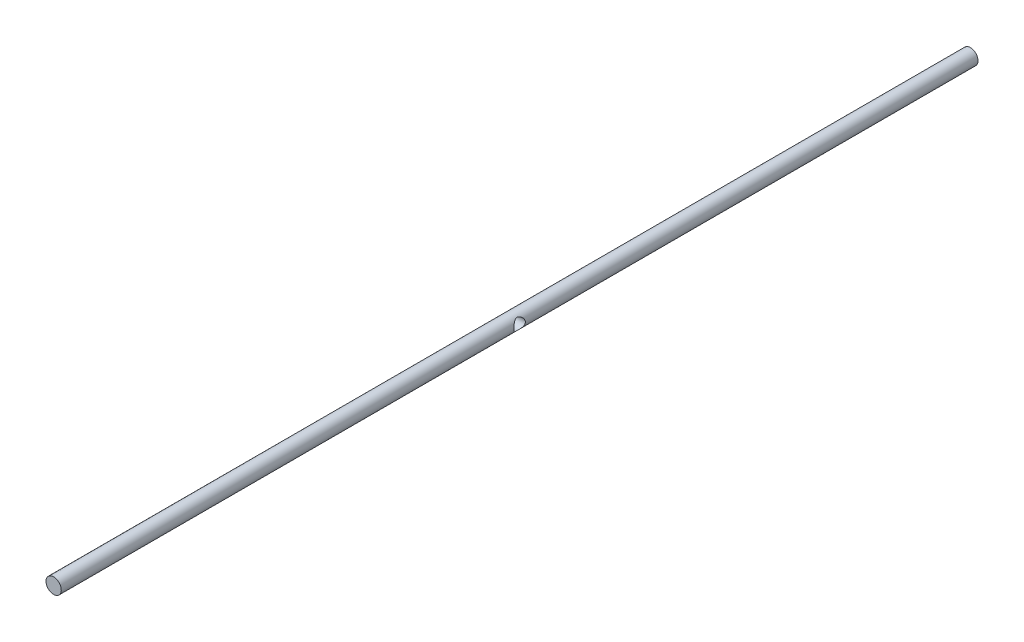
ISO-10303-21;
HEADER;
FILE_DESCRIPTION(('STEP AP214'),'2;1');
FILE_NAME('part.step','',(''),(''),'','','');
FILE_SCHEMA(('AUTOMOTIVE_DESIGN { 1 0 10303 214 1 1 1 1 }'));
ENDSEC;
DATA;
#1=APPLICATION_CONTEXT('core data for automotive mechanical design processes');
#2=APPLICATION_PROTOCOL_DEFINITION('international standard','automotive_design',2000,#1);
#3=PRODUCT_CONTEXT('',#1,'mechanical');
#4=PRODUCT('Part','Part','',(#3));
#5=PRODUCT_RELATED_PRODUCT_CATEGORY('part','',(#4));
#6=PRODUCT_DEFINITION_FORMATION('','',#4);
#7=PRODUCT_DEFINITION_CONTEXT('part definition',#1,'design');
#8=PRODUCT_DEFINITION('design','',#6,#7);
#9=PRODUCT_DEFINITION_SHAPE('','',#8);
#10=(LENGTH_UNIT() NAMED_UNIT(*) SI_UNIT(.MILLI.,.METRE.));
#11=(NAMED_UNIT(*) PLANE_ANGLE_UNIT() SI_UNIT($,.RADIAN.));
#12=(NAMED_UNIT(*) SI_UNIT($,.STERADIAN.) SOLID_ANGLE_UNIT());
#13=UNCERTAINTY_MEASURE_WITH_UNIT(LENGTH_MEASURE(1.E-05),#10,'distance_accuracy_value','');
#14=(GEOMETRIC_REPRESENTATION_CONTEXT(3) GLOBAL_UNCERTAINTY_ASSIGNED_CONTEXT((#13)) GLOBAL_UNIT_ASSIGNED_CONTEXT((#10,
#11,#12)) REPRESENTATION_CONTEXT('',''));
#15=CARTESIAN_POINT('',(0.,0.,0.));
#16=DIRECTION('',(0.,0.,1.));
#17=DIRECTION('',(1.,0.,0.));
#18=AXIS2_PLACEMENT_3D('',#15,#16,#17);
#19=CARTESIAN_POINT('',(0.,0.,381.));
#20=DIRECTION('',(0.,0.,-1.));
#21=DIRECTION('',(-1.,0.,0.));
#22=AXIS2_PLACEMENT_3D('',#19,#20,#21);
#23=CYLINDRICAL_SURFACE('',#22,6.35);
#24=CARTESIAN_POINT('',(-6.35,0.,-4.76249999999989));
#25=CARTESIAN_POINT('',(-6.34999889011326,0.116299209010284,-4.76249884995358));
#26=CARTESIAN_POINT('',(-6.34679719779935,0.232627541564826,-4.75823219253265));
#27=CARTESIAN_POINT('',(-6.33406240886009,0.464365751437165,-4.74123228514264));
#28=CARTESIAN_POINT('',(-6.32452552374318,0.579775037341468,-4.72849396905454));
#29=CARTESIAN_POINT('',(-6.29932178537642,0.808921904593725,-4.69472978212608));
#30=CARTESIAN_POINT('',(-6.28364325155278,0.92265586949063,-4.67368811889171));
#31=CARTESIAN_POINT('',(-6.24650879607319,1.14743825156485,-4.62364135446186));
#32=CARTESIAN_POINT('',(-6.22505029570613,1.2584854458909,-4.5946326987079));
#33=CARTESIAN_POINT('',(-6.17697760117065,1.47641942011833,-4.52928756430886));
#34=CARTESIAN_POINT('',(-6.15039827015815,1.58332877237456,-4.49300057233978));
#35=CARTESIAN_POINT('',(-6.09251695768087,1.79321187438471,-4.41343520594777));
#36=CARTESIAN_POINT('',(-6.06121310800096,1.89618404698207,-4.3701540653496));
#37=CARTESIAN_POINT('',(-5.96110595313219,2.19832174201322,-4.23059360444687));
#38=CARTESIAN_POINT('',(-5.88604215862559,2.39099228239341,-4.12451051997832));
#39=CARTESIAN_POINT('',(-5.71656897819981,2.77328649714528,-3.87900589903878));
#40=CARTESIAN_POINT('',(-5.62101182240466,2.96097577060041,-3.73740680323089));
#41=CARTESIAN_POINT('',(-5.42183902033636,3.31161900176228,-3.43059012603267));
#42=CARTESIAN_POINT('',(-5.31821104740761,3.4745339549048,-3.26533608036306));
#43=CARTESIAN_POINT('',(-5.15131398293457,3.71464355065618,-2.98364957737033));
#44=CARTESIAN_POINT('',(-5.08839642759211,3.80014924208561,-2.8739616269331));
#45=CARTESIAN_POINT('',(-4.96374570688253,3.96157985034353,-2.64701532460445));
#46=CARTESIAN_POINT('',(-4.90201290339736,4.03750187813244,-2.52975470592371));
#47=CARTESIAN_POINT('',(-4.7817052155672,4.17928602221378,-2.28792332780555));
#48=CARTESIAN_POINT('',(-4.72312721327799,4.24515819354578,-2.16336004988077));
#49=CARTESIAN_POINT('',(-4.61133820298109,4.36633153823971,-1.90700474712572));
#50=CARTESIAN_POINT('',(-4.55812414770429,4.42163872975714,-1.77521689304576));
#51=CARTESIAN_POINT('',(-4.44427582517159,4.53644557596069,-1.46211699726642));
#52=CARTESIAN_POINT('',(-4.38649934966295,4.59187788848287,-1.27817307356642));
#53=CARTESIAN_POINT('',(-4.31535018114969,4.65846634402581,-0.994746725299399));
#54=CARTESIAN_POINT('',(-4.29422728245458,4.67789617887078,-0.899075743995752));
#55=CARTESIAN_POINT('',(-4.25793596710256,4.7109537911948,-0.705642690547155));
#56=CARTESIAN_POINT('',(-4.24276448219179,4.7245845586927,-0.607881723381977));
#57=CARTESIAN_POINT('',(-4.21893674468419,4.74587543169949,-0.409965732854908));
#58=CARTESIAN_POINT('',(-4.21034352386483,4.75347779831771,-0.309796807312044));
#59=CARTESIAN_POINT('',(-4.20034093705962,4.76231890570772,-0.1088176785262));
#60=CARTESIAN_POINT('',(-4.19893137395975,4.7635578210877,-0.00800749295489863));
#61=CARTESIAN_POINT('',(-4.20337374340076,4.75963852863729,0.193361974088242));
#62=CARTESIAN_POINT('',(-4.20922805251657,4.75447822712796,0.293921162651351));
#63=CARTESIAN_POINT('',(-4.22788926739263,4.73788983048768,0.493843814446639));
#64=CARTESIAN_POINT('',(-4.24069624398824,4.72646167149834,0.593207265485828));
#65=CARTESIAN_POINT('',(-4.2852403212749,4.68622780810516,0.867251051248661));
#66=CARTESIAN_POINT('',(-4.32394638194482,4.65082267037082,1.03987953504589));
#67=CARTESIAN_POINT('',(-4.41687147354088,4.56265132671321,1.37621692961836));
#68=CARTESIAN_POINT('',(-4.47110540837976,4.50986843399956,1.53991709026474));
#69=CARTESIAN_POINT('',(-4.5789796272499,4.40002537741184,1.82763762183067));
#70=CARTESIAN_POINT('',(-4.63084133086612,4.34560239352006,1.95336123401585));
#71=CARTESIAN_POINT('',(-4.73927275353938,4.22708458590128,2.19810392441933));
#72=CARTESIAN_POINT('',(-4.79584488039964,4.16298480195269,2.31711952096454));
#73=CARTESIAN_POINT('',(-4.9118381765678,4.02547596393712,2.54854953533777));
#74=CARTESIAN_POINT('',(-4.97126501638891,3.95204786106949,2.66094973696371));
#75=CARTESIAN_POINT('',(-5.09118586679689,3.79631210902252,2.87877433335133));
#76=CARTESIAN_POINT('',(-5.15167970882485,3.71400585203825,2.98419981765673));
#77=CARTESIAN_POINT('',(-5.27380236872828,3.53853374029508,3.19045042984535));
#78=CARTESIAN_POINT('',(-5.33542155817546,3.44514714713773,3.29109364576376));
#79=CARTESIAN_POINT('',(-5.45685734233338,3.24938167401188,3.48451768189982));
#80=CARTESIAN_POINT('',(-5.51667322894403,3.14699932190559,3.5772954388588));
#81=CARTESIAN_POINT('',(-5.63300747283204,2.93367665220334,3.75421223551913));
#82=CARTESIAN_POINT('',(-5.68953219438701,2.82275388494243,3.83836820447578));
#83=CARTESIAN_POINT('',(-5.7981070378587,2.59242338535486,3.99754145110353));
#84=CARTESIAN_POINT('',(-5.85015680536292,2.47301498233865,4.07255800513675));
#85=CARTESIAN_POINT('',(-5.93859502008058,2.25097043945698,4.19849975057013));
#86=CARTESIAN_POINT('',(-5.97603032553162,2.14977661640437,4.2512386296468));
#87=CARTESIAN_POINT('',(-6.04654277047235,1.942623187343,4.34980135680046));
#88=CARTESIAN_POINT('',(-6.07962080600354,1.83666456721144,4.3956266268944));
#89=CARTESIAN_POINT('',(-6.1407867409813,1.62044974801033,4.4798443810637));
#90=CARTESIAN_POINT('',(-6.16887546150936,1.51019425971622,4.51823808822984));
#91=CARTESIAN_POINT('',(-6.21947275638954,1.28602254815242,4.58707885121161));
#92=CARTESIAN_POINT('',(-6.2419836038995,1.17210783758151,4.61752914448494));
#93=CARTESIAN_POINT('',(-6.28106042317835,0.940560824069623,4.67021852236314));
#94=CARTESIAN_POINT('',(-6.29758562682481,0.822908752534488,4.69240132576378));
#95=CARTESIAN_POINT('',(-6.32406752606111,0.585591049725234,4.72788281599663));
#96=CARTESIAN_POINT('',(-6.33402720897412,0.465926359648573,4.74118554331353));
#97=CARTESIAN_POINT('',(-6.34713326881087,0.225571250658382,4.75868056414595));
#98=CARTESIAN_POINT('',(-6.35028035921559,0.104880940487003,4.76287381169502));
#99=CARTESIAN_POINT('',(-6.34968041772897,-0.136444592782772,4.76207389083501));
#100=CARTESIAN_POINT('',(-6.3459339290853,-0.257079819472664,4.7570814463033));
#101=CARTESIAN_POINT('',(-6.33236726154466,-0.485096930719389,4.73896754997314));
#102=CARTESIAN_POINT('',(-6.32319801710801,-0.592587983283273,4.7267170843793));
#103=CARTESIAN_POINT('',(-6.29956495548165,-0.805930859053928,4.69505398371808));
#104=CARTESIAN_POINT('',(-6.28509946387291,-0.911782152804415,4.67563908358521));
#105=CARTESIAN_POINT('',(-6.23416160792942,-1.22578401856051,4.60702156194345));
#106=CARTESIAN_POINT('',(-6.19013661177846,-1.43056066614264,4.5474314284885));
#107=CARTESIAN_POINT('',(-6.0832928772185,-1.8333310949063,4.40090355044));
#108=CARTESIAN_POINT('',(-6.01986569359938,-2.03083042618805,4.3130748591806));
#109=CARTESIAN_POINT('',(-5.8790511898613,-2.40828851889628,4.11425259383052));
#110=CARTESIAN_POINT('',(-5.8016619386938,-2.58824484869701,4.00325581510269));
#111=CARTESIAN_POINT('',(-5.62353773977547,-2.95754753649702,3.74084167222276));
#112=CARTESIAN_POINT('',(-5.52106237048733,-3.14344320753954,3.58576965817405));
#113=CARTESIAN_POINT('',(-5.30981660517276,-3.48845400785281,3.25115690534027));
#114=CARTESIAN_POINT('',(-5.20103258551842,-3.64750804110752,3.07156198417285));
#115=CARTESIAN_POINT('',(-5.02894509831066,-3.87863587098888,2.76729114314495));
#116=CARTESIAN_POINT('',(-4.96504547399891,-3.95986728301147,2.64978895171428));
#117=CARTESIAN_POINT('',(-4.83977327695859,-4.11203021770326,2.40689926755386));
#118=CARTESIAN_POINT('',(-4.77840163860605,-4.18295795604716,2.28150890177012));
#119=CARTESIAN_POINT('',(-4.66063787526752,-4.31377865736306,2.02326659807224));
#120=CARTESIAN_POINT('',(-4.60423421273312,-4.37369755879627,1.89043318732202));
#121=CARTESIAN_POINT('',(-4.4990025472838,-4.48187020978631,1.61735022525463));
#122=CARTESIAN_POINT('',(-4.45016827583668,-4.53013363042522,1.47710694084043));
#123=CARTESIAN_POINT('',(-4.35353293763857,-4.62328336303287,1.15759177093826));
#124=CARTESIAN_POINT('',(-4.30835007522034,-4.66506090965099,0.976549013938723));
#125=CARTESIAN_POINT('',(-4.25701269661937,-4.71177908281422,0.699524783875107));
#126=CARTESIAN_POINT('',(-4.24264307261839,-4.7246910921072,0.606325443686371));
#127=CARTESIAN_POINT('',(-4.21991447835792,-4.7450037130625,0.418616170115147));
#128=CARTESIAN_POINT('',(-4.21155283156994,-4.75240677898833,0.324106839478942));
#129=CARTESIAN_POINT('',(-4.2011872218904,-4.7615726616048,0.133954831077499));
#130=CARTESIAN_POINT('',(-4.19921771895857,-4.76330490741451,0.0383087911754654));
#131=CARTESIAN_POINT('',(-4.20182318589163,-4.76100670685234,-0.152821997299421));
#132=CARTESIAN_POINT('',(-4.20639801822122,-4.75697638158626,-0.248306749219669));
#133=CARTESIAN_POINT('',(-4.22188666980965,-4.74323504842032,-0.438430314925041));
#134=CARTESIAN_POINT('',(-4.23280633007507,-4.73351880604387,-0.5330682675287));
#135=CARTESIAN_POINT('',(-4.26051540543314,-4.70859355844516,-0.720781445555733));
#136=CARTESIAN_POINT('',(-4.27730785833191,-4.69338171038877,-0.813855836035213));
#137=CARTESIAN_POINT('',(-4.32033039353147,-4.65384511328951,-1.01791679744988));
#138=CARTESIAN_POINT('',(-4.34781903730706,-4.62825761355665,-1.12839345766534));
#139=CARTESIAN_POINT('',(-4.40919076265586,-4.56982802217414,-1.34564083047186));
#140=CARTESIAN_POINT('',(-4.44307866744651,-4.53698045530095,-1.45240867533948));
#141=CARTESIAN_POINT('',(-4.51595036300489,-4.46445269907728,-1.66204572641719));
#142=CARTESIAN_POINT('',(-4.55494421133171,-4.4247589740635,-1.7649067071111));
#143=CARTESIAN_POINT('',(-4.6367045754737,-4.33900691641741,-1.96631727667216));
#144=CARTESIAN_POINT('',(-4.67946994034047,-4.29295052305787,-2.06486816720433));
#145=CARTESIAN_POINT('',(-4.7829947985753,-4.17772127471483,-2.29113435121228));
#146=CARTESIAN_POINT('',(-4.84484647998001,-4.10607445952123,-2.41709508942128));
#147=CARTESIAN_POINT('',(-4.97108986440382,-3.95229967522762,-2.66111633875838));
#148=CARTESIAN_POINT('',(-5.03548235451344,-3.87016844037569,-2.77917437076155));
#149=CARTESIAN_POINT('',(-5.1648911092052,-3.69570105421322,-3.00729638412339));
#150=CARTESIAN_POINT('',(-5.22990780720107,-3.60335726090816,-3.11735427556748));
#151=CARTESIAN_POINT('',(-5.3587816063911,-3.40875058933216,-3.32903762204703));
#152=CARTESIAN_POINT('',(-5.42263884739675,-3.30648891655268,-3.43066409911899));
#153=CARTESIAN_POINT('',(-5.54813727011885,-3.09132887327239,-3.62579067333668));
#154=CARTESIAN_POINT('',(-5.60975530899754,-2.97834830997886,-3.7192152718341));
#155=CARTESIAN_POINT('',(-5.72864113278266,-2.74273254325347,-3.89622029480029));
#156=CARTESIAN_POINT('',(-5.78590834855194,-2.62009608097834,-3.97979943215532));
#157=CARTESIAN_POINT('',(-5.89442721018253,-2.36586032770883,-4.13597925993013));
#158=CARTESIAN_POINT('',(-5.94569021399884,-2.23427872863959,-4.20860075611457));
#159=CARTESIAN_POINT('',(-6.04078339411335,-1.96267855845371,-4.34190651288053));
#160=CARTESIAN_POINT('',(-6.08461740479171,-1.822664390591,-4.40259693413768));
#161=CARTESIAN_POINT('',(-6.15185794083544,-1.57741877693897,-4.49499127840687));
#162=CARTESIAN_POINT('',(-6.17748626647477,-1.4740191867744,-4.52997759946369));
#163=CARTESIAN_POINT('',(-6.22384169023713,-1.26405767754274,-4.59299122045462));
#164=CARTESIAN_POINT('',(-6.24456997844402,-1.15749653342077,-4.62102021021539));
#165=CARTESIAN_POINT('',(-6.28067589654481,-0.942078631085032,-4.66969608116559));
#166=CARTESIAN_POINT('',(-6.29606589399019,-0.833227807097522,-4.69036002851177));
#167=CARTESIAN_POINT('',(-6.32123358358194,-0.613753154822274,-4.72409009381466));
#168=CARTESIAN_POINT('',(-6.33101414574013,-0.503130263031147,-4.73716009718214));
#169=CARTESIAN_POINT('',(-6.34191487444989,-0.326920800910606,-4.75171566902091));
#170=CARTESIAN_POINT('',(-6.34494408389906,-0.261648549896757,-4.75575703143643));
#171=CARTESIAN_POINT('',(-6.3489871212689,-0.130920627144841,-4.76114973712471));
#172=CARTESIAN_POINT('',(-6.35000062475623,-0.0654649275777552,-4.76250064736197));
#173=CARTESIAN_POINT('',(-6.35,0.,-4.76249999999989));
#174=B_SPLINE_CURVE_WITH_KNOTS('',3,(#24,#25,#26,#27,#28,#29,#30,#31,#32,#33,#34,#35,#36,#37,
#38,#39,#40,#41,#42,#43,#44,#45,#46,#47,#48,#49,#50,#51,#52,#53,#54,#55,#56,#57,#58,#59,#60,#61,
#62,#63,#64,#65,#66,#67,#68,#69,#70,#71,#72,#73,#74,#75,#76,#77,#78,#79,#80,#81,#82,#83,#84,#85,
#86,#87,#88,#89,#90,#91,#92,#93,#94,#95,#96,#97,#98,#99,#100,#101,#102,#103,#104,#105,#106,#107,
#108,#109,#110,#111,#112,#113,#114,#115,#116,#117,#118,#119,#120,#121,#122,#123,#124,#125,#126,
#127,#128,#129,#130,#131,#132,#133,#134,#135,#136,#137,#138,#139,#140,#141,#142,#143,#144,#145,
#146,#147,#148,#149,#150,#151,#152,#153,#154,#155,#156,#157,#158,#159,#160,#161,#162,#163,#164,
#165,#166,#167,#168,#169,#170,#171,#172,#173),.UNSPECIFIED.,.T.,.F.,(4,2,2,2,2,2,2,2,2,2,2,2,2,
2,2,2,2,2,2,2,2,2,2,2,2,2,2,2,2,2,2,2,2,2,2,2,2,2,2,2,2,2,2,2,2,2,2,2,2,2,2,2,2,2,2,2,2,2,2,2,2,
2,2,2,2,2,2,2,2,2,2,2,2,2,4),(0.,0.348826969653844,0.697862728397023,1.04756555362441,
1.3974246566635,1.74498106823517,2.09267527578353,2.78716228303455,3.54596161101643,
4.30594348855195,4.76346546727637,5.22112504039627,5.67832367191603,6.1352610865182,
6.73463582354853,7.03398487231736,7.33317938809093,7.6352060415502,7.93722440758682,
8.23934161327283,8.54146189705609,9.08054184069045,9.62014094684475,10.0590246637804,
10.4981341163889,10.9381551122271,11.3781072078254,11.8291031642958,12.2802739650851,
12.7305411728239,13.180844008548,13.5407901299426,13.9006621150423,14.2604748217557,
14.620140651465,14.9822120355385,15.3441185625935,15.7059871854408,16.0678272924957,
16.3931600201895,16.7185956914089,17.3689364396777,18.042229457385,18.7156156675651,
19.5014576348775,20.2890648640663,20.7580579668148,21.2272228878385,21.6952677989297,
22.1629230071761,22.7340282141133,23.0192712165018,23.3043870654148,23.591037438876,
23.8776817882011,24.164590439447,24.4516477193213,24.8011756648458,25.1509681139139,
25.5014602422859,25.8518457791523,26.3238881989897,26.7960780139453,27.2686235874385,
27.7411117961052,28.2175720907235,28.6940946048345,29.1697006194452,29.6450604035083,
29.9811084296957,30.317074755045,30.6522574444161,30.9872684875556,31.1835919009605,
31.3799469105938),.UNSPECIFIED.);
#175=CARTESIAN_POINT('',(-6.35,0.,-4.76249999999989));
#176=VERTEX_POINT('',#175);
#177=EDGE_CURVE('E10',#176,#176,#174,.T.);
#178=ORIENTED_EDGE('',*,*,#177,.T.);
#179=EDGE_LOOP('',(#178));
#180=FACE_BOUND('',#179,.T.);
#181=CARTESIAN_POINT('',(6.35,0.,-4.76249999999989));
#182=CARTESIAN_POINT('',(6.34999889011326,-0.116299209010284,-4.76249884995358));
#183=CARTESIAN_POINT('',(6.34679719779935,-0.232627541564826,-4.75823219253265));
#184=CARTESIAN_POINT('',(6.33406240886009,-0.464365751437165,-4.74123228514264));
#185=CARTESIAN_POINT('',(6.32452552374318,-0.579775037341468,-4.72849396905454));
#186=CARTESIAN_POINT('',(6.29932178537642,-0.808921904593725,-4.69472978212608));
#187=CARTESIAN_POINT('',(6.28364325155278,-0.92265586949063,-4.67368811889171));
#188=CARTESIAN_POINT('',(6.24650879607319,-1.14743825156485,-4.62364135446186));
#189=CARTESIAN_POINT('',(6.22505029570613,-1.2584854458909,-4.5946326987079));
#190=CARTESIAN_POINT('',(6.17697760117065,-1.47641942011833,-4.52928756430886));
#191=CARTESIAN_POINT('',(6.15039827015815,-1.58332877237456,-4.49300057233978));
#192=CARTESIAN_POINT('',(6.09251695768087,-1.79321187438471,-4.41343520594777));
#193=CARTESIAN_POINT('',(6.06121310800096,-1.89618404698207,-4.3701540653496));
#194=CARTESIAN_POINT('',(5.96110595313219,-2.19832174201322,-4.23059360444687));
#195=CARTESIAN_POINT('',(5.88604215862559,-2.39099228239341,-4.12451051997832));
#196=CARTESIAN_POINT('',(5.71656897819981,-2.77328649714528,-3.87900589903878));
#197=CARTESIAN_POINT('',(5.62101182240466,-2.96097577060041,-3.73740680323089));
#198=CARTESIAN_POINT('',(5.42183902033636,-3.31161900176228,-3.43059012603267));
#199=CARTESIAN_POINT('',(5.31821104740761,-3.4745339549048,-3.26533608036306));
#200=CARTESIAN_POINT('',(5.15131398293457,-3.71464355065618,-2.98364957737033));
#201=CARTESIAN_POINT('',(5.08839642759211,-3.80014924208561,-2.8739616269331));
#202=CARTESIAN_POINT('',(4.96374570688253,-3.96157985034353,-2.64701532460445));
#203=CARTESIAN_POINT('',(4.90201290339736,-4.03750187813244,-2.52975470592371));
#204=CARTESIAN_POINT('',(4.7817052155672,-4.17928602221378,-2.28792332780555));
#205=CARTESIAN_POINT('',(4.72312721327799,-4.24515819354578,-2.16336004988077));
#206=CARTESIAN_POINT('',(4.61133820298109,-4.36633153823971,-1.90700474712572));
#207=CARTESIAN_POINT('',(4.55812414770429,-4.42163872975714,-1.77521689304576));
#208=CARTESIAN_POINT('',(4.44427582517159,-4.53644557596069,-1.46211699726642));
#209=CARTESIAN_POINT('',(4.38649934966295,-4.59187788848287,-1.27817307356642));
#210=CARTESIAN_POINT('',(4.31535018114969,-4.65846634402581,-0.994746725299399));
#211=CARTESIAN_POINT('',(4.29422728245458,-4.67789617887078,-0.899075743995752));
#212=CARTESIAN_POINT('',(4.25793596710256,-4.7109537911948,-0.705642690547155));
#213=CARTESIAN_POINT('',(4.24276448219179,-4.7245845586927,-0.607881723381977));
#214=CARTESIAN_POINT('',(4.21893674468419,-4.74587543169949,-0.409965732854908));
#215=CARTESIAN_POINT('',(4.21034352386483,-4.75347779831771,-0.309796807312044));
#216=CARTESIAN_POINT('',(4.20034093705962,-4.76231890570772,-0.1088176785262));
#217=CARTESIAN_POINT('',(4.19893137395975,-4.7635578210877,-0.00800749295489863));
#218=CARTESIAN_POINT('',(4.20337374340076,-4.75963852863729,0.193361974088242));
#219=CARTESIAN_POINT('',(4.20922805251657,-4.75447822712796,0.293921162651351));
#220=CARTESIAN_POINT('',(4.22788926739263,-4.73788983048768,0.493843814446639));
#221=CARTESIAN_POINT('',(4.24069624398824,-4.72646167149834,0.593207265485828));
#222=CARTESIAN_POINT('',(4.2852403212749,-4.68622780810516,0.867251051248661));
#223=CARTESIAN_POINT('',(4.32394638194482,-4.65082267037082,1.03987953504589));
#224=CARTESIAN_POINT('',(4.41687147354088,-4.56265132671321,1.37621692961836));
#225=CARTESIAN_POINT('',(4.47110540837976,-4.50986843399956,1.53991709026474));
#226=CARTESIAN_POINT('',(4.5789796272499,-4.40002537741184,1.82763762183067));
#227=CARTESIAN_POINT('',(4.63084133086612,-4.34560239352006,1.95336123401585));
#228=CARTESIAN_POINT('',(4.73927275353938,-4.22708458590128,2.19810392441933));
#229=CARTESIAN_POINT('',(4.79584488039964,-4.16298480195269,2.31711952096454));
#230=CARTESIAN_POINT('',(4.9118381765678,-4.02547596393712,2.54854953533777));
#231=CARTESIAN_POINT('',(4.97126501638891,-3.95204786106949,2.66094973696371));
#232=CARTESIAN_POINT('',(5.09118586679689,-3.79631210902252,2.87877433335133));
#233=CARTESIAN_POINT('',(5.15167970882485,-3.71400585203825,2.98419981765673));
#234=CARTESIAN_POINT('',(5.27380236872828,-3.53853374029508,3.19045042984535));
#235=CARTESIAN_POINT('',(5.33542155817546,-3.44514714713773,3.29109364576376));
#236=CARTESIAN_POINT('',(5.45685734233338,-3.24938167401188,3.48451768189982));
#237=CARTESIAN_POINT('',(5.51667322894403,-3.14699932190559,3.5772954388588));
#238=CARTESIAN_POINT('',(5.63300747283204,-2.93367665220334,3.75421223551913));
#239=CARTESIAN_POINT('',(5.68953219438701,-2.82275388494243,3.83836820447578));
#240=CARTESIAN_POINT('',(5.7981070378587,-2.59242338535486,3.99754145110353));
#241=CARTESIAN_POINT('',(5.85015680536292,-2.47301498233865,4.07255800513675));
#242=CARTESIAN_POINT('',(5.93859502008058,-2.25097043945698,4.19849975057013));
#243=CARTESIAN_POINT('',(5.97603032553162,-2.14977661640437,4.2512386296468));
#244=CARTESIAN_POINT('',(6.04654277047235,-1.942623187343,4.34980135680046));
#245=CARTESIAN_POINT('',(6.07962080600354,-1.83666456721144,4.3956266268944));
#246=CARTESIAN_POINT('',(6.1407867409813,-1.62044974801033,4.4798443810637));
#247=CARTESIAN_POINT('',(6.16887546150936,-1.51019425971622,4.51823808822984));
#248=CARTESIAN_POINT('',(6.21947275638954,-1.28602254815242,4.58707885121161));
#249=CARTESIAN_POINT('',(6.2419836038995,-1.17210783758151,4.61752914448494));
#250=CARTESIAN_POINT('',(6.28106042317835,-0.940560824069623,4.67021852236314));
#251=CARTESIAN_POINT('',(6.29758562682481,-0.822908752534488,4.69240132576378));
#252=CARTESIAN_POINT('',(6.32406752606111,-0.585591049725234,4.72788281599663));
#253=CARTESIAN_POINT('',(6.33402720897412,-0.465926359648573,4.74118554331353));
#254=CARTESIAN_POINT('',(6.34713326881087,-0.225571250658382,4.75868056414595));
#255=CARTESIAN_POINT('',(6.35028035921559,-0.104880940487003,4.76287381169502));
#256=CARTESIAN_POINT('',(6.34968041772897,0.136444592782772,4.76207389083501));
#257=CARTESIAN_POINT('',(6.3459339290853,0.257079819472664,4.7570814463033));
#258=CARTESIAN_POINT('',(6.33236726154466,0.485096930719389,4.73896754997314));
#259=CARTESIAN_POINT('',(6.32319801710801,0.592587983283273,4.7267170843793));
#260=CARTESIAN_POINT('',(6.29956495548165,0.805930859053928,4.69505398371808));
#261=CARTESIAN_POINT('',(6.28509946387291,0.911782152804415,4.67563908358521));
#262=CARTESIAN_POINT('',(6.23416160792942,1.22578401856051,4.60702156194345));
#263=CARTESIAN_POINT('',(6.19013661177846,1.43056066614264,4.5474314284885));
#264=CARTESIAN_POINT('',(6.0832928772185,1.8333310949063,4.40090355044));
#265=CARTESIAN_POINT('',(6.01986569359938,2.03083042618805,4.3130748591806));
#266=CARTESIAN_POINT('',(5.8790511898613,2.40828851889628,4.11425259383052));
#267=CARTESIAN_POINT('',(5.8016619386938,2.58824484869701,4.00325581510269));
#268=CARTESIAN_POINT('',(5.62353773977547,2.95754753649702,3.74084167222276));
#269=CARTESIAN_POINT('',(5.52106237048733,3.14344320753954,3.58576965817405));
#270=CARTESIAN_POINT('',(5.30981660517276,3.48845400785281,3.25115690534027));
#271=CARTESIAN_POINT('',(5.20103258551842,3.64750804110752,3.07156198417285));
#272=CARTESIAN_POINT('',(5.02894509831066,3.87863587098888,2.76729114314495));
#273=CARTESIAN_POINT('',(4.96504547399891,3.95986728301147,2.64978895171428));
#274=CARTESIAN_POINT('',(4.83977327695859,4.11203021770326,2.40689926755386));
#275=CARTESIAN_POINT('',(4.77840163860605,4.18295795604716,2.28150890177012));
#276=CARTESIAN_POINT('',(4.66063787526752,4.31377865736306,2.02326659807224));
#277=CARTESIAN_POINT('',(4.60423421273312,4.37369755879627,1.89043318732202));
#278=CARTESIAN_POINT('',(4.4990025472838,4.48187020978631,1.61735022525463));
#279=CARTESIAN_POINT('',(4.45016827583668,4.53013363042522,1.47710694084043));
#280=CARTESIAN_POINT('',(4.35353293763857,4.62328336303287,1.15759177093826));
#281=CARTESIAN_POINT('',(4.30835007522034,4.66506090965099,0.976549013938723));
#282=CARTESIAN_POINT('',(4.25701269661937,4.71177908281422,0.699524783875107));
#283=CARTESIAN_POINT('',(4.24264307261839,4.7246910921072,0.606325443686371));
#284=CARTESIAN_POINT('',(4.21991447835792,4.7450037130625,0.418616170115147));
#285=CARTESIAN_POINT('',(4.21155283156994,4.75240677898833,0.324106839478942));
#286=CARTESIAN_POINT('',(4.2011872218904,4.7615726616048,0.133954831077499));
#287=CARTESIAN_POINT('',(4.19921771895857,4.76330490741451,0.0383087911754654));
#288=CARTESIAN_POINT('',(4.20182318589163,4.76100670685234,-0.152821997299421));
#289=CARTESIAN_POINT('',(4.20639801822122,4.75697638158626,-0.248306749219669));
#290=CARTESIAN_POINT('',(4.22188666980965,4.74323504842032,-0.438430314925041));
#291=CARTESIAN_POINT('',(4.23280633007507,4.73351880604387,-0.5330682675287));
#292=CARTESIAN_POINT('',(4.26051540543314,4.70859355844516,-0.720781445555733));
#293=CARTESIAN_POINT('',(4.27730785833191,4.69338171038877,-0.813855836035213));
#294=CARTESIAN_POINT('',(4.32033039353147,4.65384511328951,-1.01791679744988));
#295=CARTESIAN_POINT('',(4.34781903730706,4.62825761355665,-1.12839345766534));
#296=CARTESIAN_POINT('',(4.40919076265586,4.56982802217414,-1.34564083047186));
#297=CARTESIAN_POINT('',(4.44307866744651,4.53698045530095,-1.45240867533948));
#298=CARTESIAN_POINT('',(4.51595036300489,4.46445269907728,-1.66204572641719));
#299=CARTESIAN_POINT('',(4.55494421133171,4.4247589740635,-1.7649067071111));
#300=CARTESIAN_POINT('',(4.6367045754737,4.33900691641741,-1.96631727667216));
#301=CARTESIAN_POINT('',(4.67946994034047,4.29295052305787,-2.06486816720433));
#302=CARTESIAN_POINT('',(4.7829947985753,4.17772127471483,-2.29113435121228));
#303=CARTESIAN_POINT('',(4.84484647998001,4.10607445952123,-2.41709508942128));
#304=CARTESIAN_POINT('',(4.97108986440382,3.95229967522762,-2.66111633875838));
#305=CARTESIAN_POINT('',(5.03548235451344,3.87016844037569,-2.77917437076155));
#306=CARTESIAN_POINT('',(5.1648911092052,3.69570105421322,-3.00729638412339));
#307=CARTESIAN_POINT('',(5.22990780720107,3.60335726090816,-3.11735427556748));
#308=CARTESIAN_POINT('',(5.3587816063911,3.40875058933216,-3.32903762204703));
#309=CARTESIAN_POINT('',(5.42263884739675,3.30648891655268,-3.43066409911899));
#310=CARTESIAN_POINT('',(5.54813727011885,3.09132887327239,-3.62579067333668));
#311=CARTESIAN_POINT('',(5.60975530899754,2.97834830997886,-3.7192152718341));
#312=CARTESIAN_POINT('',(5.72864113278266,2.74273254325347,-3.89622029480029));
#313=CARTESIAN_POINT('',(5.78590834855194,2.62009608097834,-3.97979943215532));
#314=CARTESIAN_POINT('',(5.89442721018253,2.36586032770883,-4.13597925993013));
#315=CARTESIAN_POINT('',(5.94569021399884,2.23427872863959,-4.20860075611457));
#316=CARTESIAN_POINT('',(6.04078339411335,1.96267855845371,-4.34190651288053));
#317=CARTESIAN_POINT('',(6.08461740479171,1.822664390591,-4.40259693413768));
#318=CARTESIAN_POINT('',(6.15185794083544,1.57741877693897,-4.49499127840687));
#319=CARTESIAN_POINT('',(6.17748626647477,1.4740191867744,-4.52997759946369));
#320=CARTESIAN_POINT('',(6.22384169023713,1.26405767754274,-4.59299122045462));
#321=CARTESIAN_POINT('',(6.24456997844402,1.15749653342077,-4.62102021021539));
#322=CARTESIAN_POINT('',(6.28067589654481,0.942078631085032,-4.66969608116559));
#323=CARTESIAN_POINT('',(6.29606589399019,0.833227807097522,-4.69036002851177));
#324=CARTESIAN_POINT('',(6.32123358358194,0.613753154822274,-4.72409009381466));
#325=CARTESIAN_POINT('',(6.33101414574013,0.503130263031147,-4.73716009718214));
#326=CARTESIAN_POINT('',(6.34191487444989,0.326920800910606,-4.75171566902091));
#327=CARTESIAN_POINT('',(6.34494408389906,0.261648549896757,-4.75575703143643));
#328=CARTESIAN_POINT('',(6.3489871212689,0.130920627144841,-4.76114973712471));
#329=CARTESIAN_POINT('',(6.35000062475623,0.0654649275777552,-4.76250064736197));
#330=CARTESIAN_POINT('',(6.35,0.,-4.76249999999989));
#331=B_SPLINE_CURVE_WITH_KNOTS('',3,(#181,#182,#183,#184,#185,#186,#187,#188,#189,#190,#191,
#192,#193,#194,#195,#196,#197,#198,#199,#200,#201,#202,#203,#204,#205,#206,#207,#208,#209,#210,
#211,#212,#213,#214,#215,#216,#217,#218,#219,#220,#221,#222,#223,#224,#225,#226,#227,#228,#229,
#230,#231,#232,#233,#234,#235,#236,#237,#238,#239,#240,#241,#242,#243,#244,#245,#246,#247,#248,
#249,#250,#251,#252,#253,#254,#255,#256,#257,#258,#259,#260,#261,#262,#263,#264,#265,#266,#267,
#268,#269,#270,#271,#272,#273,#274,#275,#276,#277,#278,#279,#280,#281,#282,#283,#284,#285,#286,
#287,#288,#289,#290,#291,#292,#293,#294,#295,#296,#297,#298,#299,#300,#301,#302,#303,#304,#305,
#306,#307,#308,#309,#310,#311,#312,#313,#314,#315,#316,#317,#318,#319,#320,#321,#322,#323,#324,
#325,#326,#327,#328,#329,#330),.UNSPECIFIED.,.T.,.F.,(4,2,2,2,2,2,2,2,2,2,2,2,2,2,2,2,2,2,2,2,2,
2,2,2,2,2,2,2,2,2,2,2,2,2,2,2,2,2,2,2,2,2,2,2,2,2,2,2,2,2,2,2,2,2,2,2,2,2,2,2,2,2,2,2,2,2,2,2,2,
2,2,2,2,2,4),(0.,0.348826969653844,0.697862728397023,1.04756555362441,1.3974246566635,
1.74498106823517,2.09267527578353,2.78716228303455,3.54596161101643,4.30594348855195,
4.76346546727637,5.22112504039627,5.67832367191603,6.1352610865182,6.73463582354853,
7.03398487231736,7.33317938809093,7.6352060415502,7.93722440758682,8.23934161327283,
8.54146189705609,9.08054184069045,9.62014094684475,10.0590246637804,10.4981341163889,
10.9381551122271,11.3781072078254,11.8291031642958,12.2802739650851,12.7305411728239,
13.180844008548,13.5407901299426,13.9006621150423,14.2604748217557,14.620140651465,
14.9822120355385,15.3441185625935,15.7059871854408,16.0678272924957,16.3931600201895,
16.7185956914089,17.3689364396777,18.042229457385,18.7156156675651,19.5014576348775,
20.2890648640663,20.7580579668148,21.2272228878385,21.6952677989297,22.1629230071761,
22.7340282141133,23.0192712165018,23.3043870654148,23.591037438876,23.8776817882011,
24.164590439447,24.4516477193213,24.8011756648458,25.1509681139139,25.5014602422859,
25.8518457791523,26.3238881989897,26.7960780139453,27.2686235874385,27.7411117961052,
28.2175720907235,28.6940946048345,29.1697006194452,29.6450604035083,29.9811084296957,
30.317074755045,30.6522574444161,30.9872684875556,31.1835919009605,31.3799469105938),.UNSPECIFIED.);
#332=CARTESIAN_POINT('',(6.35,0.,-4.76249999999989));
#333=VERTEX_POINT('',#332);
#334=EDGE_CURVE('E45',#333,#333,#331,.T.);
#335=ORIENTED_EDGE('',*,*,#334,.T.);
#336=EDGE_LOOP('',(#335));
#337=FACE_BOUND('',#336,.T.);
#338=CARTESIAN_POINT('',(0.,0.,381.));
#339=DIRECTION('',(0.,0.,1.));
#340=DIRECTION('',(1.,0.,0.));
#341=AXIS2_PLACEMENT_3D('',#338,#339,#340);
#342=CIRCLE('',#341,6.35);
#343=CARTESIAN_POINT('',(6.35,0.,381.));
#344=VERTEX_POINT('',#343);
#345=EDGE_CURVE('E49',#344,#344,#342,.T.);
#346=ORIENTED_EDGE('',*,*,#345,.F.);
#347=EDGE_LOOP('',(#346));
#348=FACE_BOUND('',#347,.T.);
#349=CARTESIAN_POINT('',(0.,0.,-381.));
#350=DIRECTION('',(0.,0.,1.));
#351=DIRECTION('',(1.,0.,0.));
#352=AXIS2_PLACEMENT_3D('',#349,#350,#351);
#353=CIRCLE('',#352,6.35);
#354=CARTESIAN_POINT('',(6.35,0.,-381.));
#355=VERTEX_POINT('',#354);
#356=EDGE_CURVE('E53',#355,#355,#353,.T.);
#357=ORIENTED_EDGE('',*,*,#356,.T.);
#358=EDGE_LOOP('',(#357));
#359=FACE_BOUND('',#358,.T.);
#360=ADVANCED_FACE('F35',(#180,#337,#348,#359),#23,.T.);
#361=CARTESIAN_POINT('',(0.,0.,381.));
#362=DIRECTION('',(0.,0.,1.));
#363=DIRECTION('',(1.,0.,0.));
#364=AXIS2_PLACEMENT_3D('',#361,#362,#363);
#365=PLANE('',#364);
#366=ORIENTED_EDGE('',*,*,#345,.T.);
#367=EDGE_LOOP('',(#366));
#368=FACE_BOUND('',#367,.T.);
#369=ADVANCED_FACE('F64',(#368),#365,.T.);
#370=CARTESIAN_POINT('',(0.,0.,-381.));
#371=DIRECTION('',(0.,0.,1.));
#372=DIRECTION('',(1.,0.,0.));
#373=AXIS2_PLACEMENT_3D('',#370,#371,#372);
#374=PLANE('',#373);
#375=ORIENTED_EDGE('',*,*,#356,.F.);
#376=EDGE_LOOP('',(#375));
#377=FACE_BOUND('',#376,.T.);
#378=ADVANCED_FACE('F62',(#377),#374,.F.);
#379=CARTESIAN_POINT('',(-6.35,0.,1.11022302462516E-13));
#380=DIRECTION('',(1.,0.,0.));
#381=DIRECTION('',(0.,0.,-1.));
#382=AXIS2_PLACEMENT_3D('',#379,#380,#381);
#383=CYLINDRICAL_SURFACE('',#382,4.7625);
#384=ORIENTED_EDGE('',*,*,#334,.F.);
#385=EDGE_LOOP('',(#384));
#386=FACE_BOUND('',#385,.T.);
#387=ORIENTED_EDGE('',*,*,#177,.F.);
#388=EDGE_LOOP('',(#387));
#389=FACE_BOUND('',#388,.T.);
#390=ADVANCED_FACE('F58',(#386,#389),#383,.F.);
#391=CLOSED_SHELL('',(#360,#369,#378,#390));
#392=MANIFOLD_SOLID_BREP('B2',#391);
#393=ADVANCED_BREP_SHAPE_REPRESENTATION('',(#18,#392),#14);
#394=SHAPE_DEFINITION_REPRESENTATION(#9,#393);
ENDSEC;
END-ISO-10303-21;
